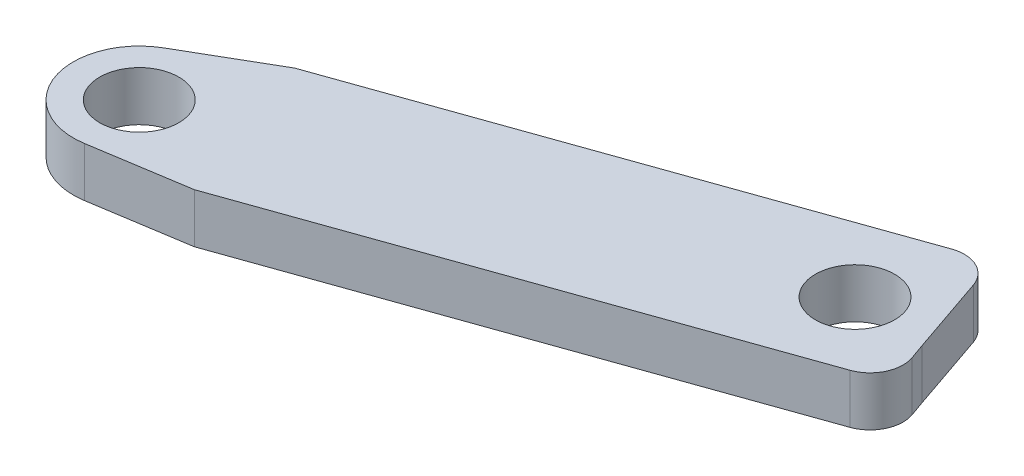
ISO-10303-21;
HEADER;
FILE_DESCRIPTION(('STEP AP214'),'2;1');
FILE_NAME('part.step','',(''),(''),'','','');
FILE_SCHEMA(('AUTOMOTIVE_DESIGN { 1 0 10303 214 1 1 1 1 }'));
ENDSEC;
DATA;
#1=APPLICATION_CONTEXT('core data for automotive mechanical design processes');
#2=APPLICATION_PROTOCOL_DEFINITION('international standard','automotive_design',2000,#1);
#3=PRODUCT_CONTEXT('',#1,'mechanical');
#4=PRODUCT('Part','Part','',(#3));
#5=PRODUCT_RELATED_PRODUCT_CATEGORY('part','',(#4));
#6=PRODUCT_DEFINITION_FORMATION('','',#4);
#7=PRODUCT_DEFINITION_CONTEXT('part definition',#1,'design');
#8=PRODUCT_DEFINITION('design','',#6,#7);
#9=PRODUCT_DEFINITION_SHAPE('','',#8);
#10=(LENGTH_UNIT() NAMED_UNIT(*) SI_UNIT(.MILLI.,.METRE.));
#11=(NAMED_UNIT(*) PLANE_ANGLE_UNIT() SI_UNIT($,.RADIAN.));
#12=(NAMED_UNIT(*) SI_UNIT($,.STERADIAN.) SOLID_ANGLE_UNIT());
#13=UNCERTAINTY_MEASURE_WITH_UNIT(LENGTH_MEASURE(1.E-05),#10,'distance_accuracy_value','');
#14=(GEOMETRIC_REPRESENTATION_CONTEXT(3) GLOBAL_UNCERTAINTY_ASSIGNED_CONTEXT((#13)) GLOBAL_UNIT_ASSIGNED_CONTEXT((#10,
#11,#12)) REPRESENTATION_CONTEXT('',''));
#15=CARTESIAN_POINT('',(0.,0.,0.));
#16=DIRECTION('',(0.,0.,1.));
#17=DIRECTION('',(1.,0.,0.));
#18=AXIS2_PLACEMENT_3D('',#15,#16,#17);
#19=CARTESIAN_POINT('',(12.5415540162845,1.5,11.5198173316022));
#20=DIRECTION('',(0.,1.,0.));
#21=DIRECTION('',(0.,0.,1.));
#22=AXIS2_PLACEMENT_3D('',#19,#20,#21);
#23=PLANE('',#22);
#24=CARTESIAN_POINT('',(-4.01703028974158,1.5,18.9733521381694));
#25=DIRECTION('',(0.,1.,0.));
#26=DIRECTION('',(0.,0.,1.));
#27=AXIS2_PLACEMENT_3D('',#24,#25,#26);
#28=CIRCLE('',#27,1.20000000000027);
#29=CARTESIAN_POINT('',(-4.01703028974158,1.5,20.1733521381697));
#30=VERTEX_POINT('',#29);
#31=EDGE_CURVE('E140',#30,#30,#28,.T.);
#32=ORIENTED_EDGE('',*,*,#31,.F.);
#33=EDGE_LOOP('',(#32));
#34=FACE_BOUND('',#33,.T.);
#35=DIRECTION('',(-0.942666534966548,0.,0.333736129081288));
#36=VECTOR('',#35,1.);
#37=CARTESIAN_POINT('',(9.05204500921084,1.5,11.6944021103235));
#38=LINE('',#37,#36);
#39=CARTESIAN_POINT('',(12.2078178872032,1.5,10.5771507966357));
#40=VERTEX_POINT('',#39);
#41=CARTESIAN_POINT('',(-2.49470427502801,1.5,15.7823454780497));
#42=VERTEX_POINT('',#41);
#43=EDGE_CURVE('E97',#40,#42,#38,.T.);
#44=ORIENTED_EDGE('',*,*,#43,.T.);
#45=DIRECTION('',(-0.865625456021708,0.,0.5006920908974));
#46=VECTOR('',#45,1.);
#47=CARTESIAN_POINT('',(-2.49470427502801,1.5,15.7823454780497));
#48=LINE('',#47,#46);
#49=CARTESIAN_POINT('',(-5.01841447153637,1.5,17.242101226126));
#50=VERTEX_POINT('',#49);
#51=EDGE_CURVE('E234',#42,#50,#48,.T.);
#52=ORIENTED_EDGE('',*,*,#51,.T.);
#53=CARTESIAN_POINT('',(-4.01703028974158,1.5,18.9733521381694));
#54=DIRECTION('',(0.,1.,0.));
#55=DIRECTION('',(0.,0.,1.));
#56=AXIS2_PLACEMENT_3D('',#53,#54,#55);
#57=CIRCLE('',#56,2.);
#58=CARTESIAN_POINT('',(-3.70603693930846,1.5,20.9490249693807));
#59=VERTEX_POINT('',#58);
#60=EDGE_CURVE('E236',#50,#59,#57,.T.);
#61=ORIENTED_EDGE('',*,*,#60,.T.);
#62=DIRECTION('',(0.987836415605638,0.,-0.155496675216562));
#63=VECTOR('',#62,1.);
#64=CARTESIAN_POINT('',(-3.70603693930846,1.5,20.9490249693807));
#65=LINE('',#64,#63);
#66=CARTESIAN_POINT('',(-0.826023629621666,1.5,20.4956781528826));
#67=VERTEX_POINT('',#66);
#68=EDGE_CURVE('E238',#59,#67,#65,.T.);
#69=ORIENTED_EDGE('',*,*,#68,.T.);
#70=DIRECTION('',(0.942666534966548,0.,-0.333736129081287));
#71=VECTOR('',#70,1.);
#72=CARTESIAN_POINT('',(10.7207256546172,1.5,16.4077347851563));
#73=LINE('',#72,#71);
#74=CARTESIAN_POINT('',(13.8538364026168,1.5,15.2985066390044));
#75=VERTEX_POINT('',#74);
#76=EDGE_CURVE('E243',#67,#75,#73,.T.);
#77=ORIENTED_EDGE('',*,*,#76,.T.);
#78=CARTESIAN_POINT('',(13.5201002735355,1.5,14.3558401040379));
#79=DIRECTION('',(0.,1.,0.));
#80=DIRECTION('',(0.,0.,1.));
#81=AXIS2_PLACEMENT_3D('',#78,#79,#80);
#82=CIRCLE('',#81,1.);
#83=CARTESIAN_POINT('',(14.462766808502,1.5,14.0221039749566));
#84=VERTEX_POINT('',#83);
#85=EDGE_CURVE('E120',#75,#84,#82,.T.);
#86=ORIENTED_EDGE('',*,*,#85,.T.);
#87=DIRECTION('',(-0.333736129081291,0.,-0.942666534966547));
#88=VECTOR('',#87,1.);
#89=CARTESIAN_POINT('',(14.4627668085021,1.5,14.0221039749566));
#90=LINE('',#89,#88);
#91=CARTESIAN_POINT('',(14.3006668668351,1.5,13.564238682547));
#92=VERTEX_POINT('',#91);
#93=EDGE_CURVE('E114',#84,#92,#90,.T.);
#94=ORIENTED_EDGE('',*,*,#93,.T.);
#95=DIRECTION('',(-0.32469068500717,0.,-0.945820257273851));
#96=VECTOR('',#95,1.);
#97=CARTESIAN_POINT('',(13.4873742735583,1.5,11.1951266465951));
#98=LINE('',#97,#96);
#99=CARTESIAN_POINT('',(13.4873742735583,1.5,11.1951266465951));
#100=VERTEX_POINT('',#99);
#101=EDGE_CURVE('E118',#92,#100,#98,.T.);
#102=ORIENTED_EDGE('',*,*,#101,.T.);
#103=CARTESIAN_POINT('',(12.5415540162845,1.5,11.5198173316022));
#104=DIRECTION('',(0.,1.,0.));
#105=DIRECTION('',(0.,0.,1.));
#106=AXIS2_PLACEMENT_3D('',#103,#104,#105);
#107=CIRCLE('',#106,0.999999999999998);
#108=EDGE_CURVE('E52',#100,#40,#107,.T.);
#109=ORIENTED_EDGE('',*,*,#108,.T.);
#110=EDGE_LOOP('',(#44,#52,#61,#69,#77,#86,#94,#102,#109));
#111=FACE_BOUND('',#110,.T.);
#112=CARTESIAN_POINT('',(12.0073850355886,1.5,13.3001621573067));
#113=DIRECTION('',(0.,1.,0.));
#114=DIRECTION('',(0.,0.,1.));
#115=AXIS2_PLACEMENT_3D('',#112,#113,#114);
#116=CIRCLE('',#115,1.20000000000001);
#117=CARTESIAN_POINT('',(12.0073850355886,1.5,14.5001621573067));
#118=VERTEX_POINT('',#117);
#119=EDGE_CURVE('E171',#118,#118,#116,.T.);
#120=ORIENTED_EDGE('',*,*,#119,.F.);
#121=EDGE_LOOP('',(#120));
#122=FACE_BOUND('',#121,.T.);
#123=ADVANCED_FACE('F33',(#34,#111,#122),#23,.T.);
#124=CARTESIAN_POINT('',(12.5415540162845,0.,11.5198173316022));
#125=DIRECTION('',(0.,1.,0.));
#126=DIRECTION('',(0.,0.,1.));
#127=AXIS2_PLACEMENT_3D('',#124,#125,#126);
#128=PLANE('',#127);
#129=DIRECTION('',(-0.942666534966548,0.,0.333736129081287));
#130=VECTOR('',#129,1.);
#131=CARTESIAN_POINT('',(9.05204500921084,0.,11.6944021103235));
#132=LINE('',#131,#130);
#133=CARTESIAN_POINT('',(12.2078178872032,0.,10.5771507966357));
#134=VERTEX_POINT('',#133);
#135=CARTESIAN_POINT('',(-2.49470427502801,0.,15.7823454780497));
#136=VERTEX_POINT('',#135);
#137=EDGE_CURVE('E91',#134,#136,#132,.T.);
#138=ORIENTED_EDGE('',*,*,#137,.F.);
#139=CARTESIAN_POINT('',(12.5415540162845,0.,11.5198173316022));
#140=DIRECTION('',(0.,1.,0.));
#141=DIRECTION('',(0.,0.,1.));
#142=AXIS2_PLACEMENT_3D('',#139,#140,#141);
#143=CIRCLE('',#142,0.999999999999998);
#144=CARTESIAN_POINT('',(13.4873742735583,0.,11.1951266465951));
#145=VERTEX_POINT('',#144);
#146=EDGE_CURVE('E154',#145,#134,#143,.T.);
#147=ORIENTED_EDGE('',*,*,#146,.F.);
#148=DIRECTION('',(-0.32469068500717,0.,-0.945820257273851));
#149=VECTOR('',#148,1.);
#150=CARTESIAN_POINT('',(13.4873742735583,0.,11.1951266465951));
#151=LINE('',#150,#149);
#152=CARTESIAN_POINT('',(14.3006668668351,0.,13.564238682547));
#153=VERTEX_POINT('',#152);
#154=EDGE_CURVE('E84',#153,#145,#151,.T.);
#155=ORIENTED_EDGE('',*,*,#154,.F.);
#156=DIRECTION('',(-0.333736129081291,0.,-0.942666534966547));
#157=VECTOR('',#156,1.);
#158=CARTESIAN_POINT('',(14.4627668085021,0.,14.0221039749566));
#159=LINE('',#158,#157);
#160=CARTESIAN_POINT('',(14.462766808502,0.,14.0221039749566));
#161=VERTEX_POINT('',#160);
#162=EDGE_CURVE('E128',#161,#153,#159,.T.);
#163=ORIENTED_EDGE('',*,*,#162,.F.);
#164=CARTESIAN_POINT('',(13.5201002735355,0.,14.3558401040379));
#165=DIRECTION('',(0.,1.,0.));
#166=DIRECTION('',(0.,0.,1.));
#167=AXIS2_PLACEMENT_3D('',#164,#165,#166);
#168=CIRCLE('',#167,1.);
#169=CARTESIAN_POINT('',(13.8538364026168,0.,15.2985066390044));
#170=VERTEX_POINT('',#169);
#171=EDGE_CURVE('E150',#170,#161,#168,.T.);
#172=ORIENTED_EDGE('',*,*,#171,.F.);
#173=DIRECTION('',(0.942666534966548,0.,-0.333736129081287));
#174=VECTOR('',#173,1.);
#175=CARTESIAN_POINT('',(10.7207256546172,0.,16.4077347851563));
#176=LINE('',#175,#174);
#177=CARTESIAN_POINT('',(-0.826023629621666,0.,20.4956781528826));
#178=VERTEX_POINT('',#177);
#179=EDGE_CURVE('E148',#178,#170,#176,.T.);
#180=ORIENTED_EDGE('',*,*,#179,.F.);
#181=DIRECTION('',(0.987836415605636,0.,-0.155496675216575));
#182=VECTOR('',#181,1.);
#183=CARTESIAN_POINT('',(-0.826023629621666,0.,20.4956781528826));
#184=LINE('',#183,#182);
#185=CARTESIAN_POINT('',(-3.70603693930846,0.,20.9490249693807));
#186=VERTEX_POINT('',#185);
#187=EDGE_CURVE('E145',#186,#178,#184,.T.);
#188=ORIENTED_EDGE('',*,*,#187,.F.);
#189=CARTESIAN_POINT('',(-4.01703028974158,0.,18.9733521381694));
#190=DIRECTION('',(0.,1.,0.));
#191=DIRECTION('',(0.,0.,1.));
#192=AXIS2_PLACEMENT_3D('',#189,#190,#191);
#193=CIRCLE('',#192,2.);
#194=CARTESIAN_POINT('',(-5.01841447153637,0.,17.242101226126));
#195=VERTEX_POINT('',#194);
#196=EDGE_CURVE('E142',#195,#186,#193,.T.);
#197=ORIENTED_EDGE('',*,*,#196,.F.);
#198=DIRECTION('',(-0.86562545602171,0.,0.500692090897396));
#199=VECTOR('',#198,1.);
#200=CARTESIAN_POINT('',(-2.71483185404596,0.,15.9096709131279));
#201=LINE('',#200,#199);
#202=EDGE_CURVE('E139',#136,#195,#201,.T.);
#203=ORIENTED_EDGE('',*,*,#202,.F.);
#204=EDGE_LOOP('',(#138,#147,#155,#163,#172,#180,#188,#197,#203));
#205=FACE_BOUND('',#204,.T.);
#206=CARTESIAN_POINT('',(-4.01703028974158,0.,18.9733521381694));
#207=DIRECTION('',(0.,1.,0.));
#208=DIRECTION('',(0.,0.,1.));
#209=AXIS2_PLACEMENT_3D('',#206,#207,#208);
#210=CIRCLE('',#209,1.20000000000027);
#211=CARTESIAN_POINT('',(-4.01703028974158,0.,20.1733521381697));
#212=VERTEX_POINT('',#211);
#213=EDGE_CURVE('E37',#212,#212,#210,.T.);
#214=ORIENTED_EDGE('',*,*,#213,.T.);
#215=EDGE_LOOP('',(#214));
#216=FACE_BOUND('',#215,.T.);
#217=CARTESIAN_POINT('',(12.0073850355886,0.,13.3001621573067));
#218=DIRECTION('',(0.,1.,0.));
#219=DIRECTION('',(0.,0.,1.));
#220=AXIS2_PLACEMENT_3D('',#217,#218,#219);
#221=CIRCLE('',#220,1.20000000000001);
#222=CARTESIAN_POINT('',(12.0073850355886,0.,14.5001621573067));
#223=VERTEX_POINT('',#222);
#224=EDGE_CURVE('E174',#223,#223,#221,.T.);
#225=ORIENTED_EDGE('',*,*,#224,.T.);
#226=EDGE_LOOP('',(#225));
#227=FACE_BOUND('',#226,.T.);
#228=ADVANCED_FACE('F182',(#205,#216,#227),#128,.F.);
#229=CARTESIAN_POINT('',(9.05204500921084,1.5,11.6944021103235));
#230=DIRECTION('',(0.333736129081287,0.,0.942666534966548));
#231=DIRECTION('',(0.942666534966548,0.,-0.333736129081287));
#232=AXIS2_PLACEMENT_3D('',#229,#230,#231);
#233=PLANE('',#232);
#234=ORIENTED_EDGE('',*,*,#137,.T.);
#235=DIRECTION('',(0.,-1.,0.));
#236=VECTOR('',#235,1.);
#237=CARTESIAN_POINT('',(-2.49470427502801,1.5,15.7823454780497));
#238=LINE('',#237,#236);
#239=EDGE_CURVE('E12',#42,#136,#238,.T.);
#240=ORIENTED_EDGE('',*,*,#239,.F.);
#241=ORIENTED_EDGE('',*,*,#43,.F.);
#242=DIRECTION('',(0.,-1.,0.));
#243=VECTOR('',#242,1.);
#244=CARTESIAN_POINT('',(12.2078178872032,1.5,10.5771507966357));
#245=LINE('',#244,#243);
#246=EDGE_CURVE('E134',#40,#134,#245,.T.);
#247=ORIENTED_EDGE('',*,*,#246,.T.);
#248=EDGE_LOOP('',(#234,#240,#241,#247));
#249=FACE_BOUND('',#248,.T.);
#250=ADVANCED_FACE('F201',(#249),#233,.F.);
#251=CARTESIAN_POINT('',(-2.71483185404596,1.5,15.9096709131279));
#252=DIRECTION('',(0.500692090897396,0.,0.86562545602171));
#253=DIRECTION('',(0.86562545602171,0.,-0.500692090897396));
#254=AXIS2_PLACEMENT_3D('',#251,#252,#253);
#255=PLANE('',#254);
#256=ORIENTED_EDGE('',*,*,#202,.T.);
#257=DIRECTION('',(0.,-1.,0.));
#258=VECTOR('',#257,1.);
#259=CARTESIAN_POINT('',(-5.01841447153637,1.5,17.242101226126));
#260=LINE('',#259,#258);
#261=EDGE_CURVE('E43',#50,#195,#260,.T.);
#262=ORIENTED_EDGE('',*,*,#261,.F.);
#263=ORIENTED_EDGE('',*,*,#51,.F.);
#264=ORIENTED_EDGE('',*,*,#239,.T.);
#265=EDGE_LOOP('',(#256,#262,#263,#264));
#266=FACE_BOUND('',#265,.T.);
#267=ADVANCED_FACE('F223',(#266),#255,.F.);
#268=CARTESIAN_POINT('',(-4.01703028974158,1.5,18.9733521381694));
#269=DIRECTION('',(0.,-1.,0.));
#270=DIRECTION('',(0.,0.,-1.));
#271=AXIS2_PLACEMENT_3D('',#268,#269,#270);
#272=CYLINDRICAL_SURFACE('',#271,2.);
#273=ORIENTED_EDGE('',*,*,#196,.T.);
#274=DIRECTION('',(0.,-1.,0.));
#275=VECTOR('',#274,1.);
#276=CARTESIAN_POINT('',(-3.70603693930846,1.5,20.9490249693807));
#277=LINE('',#276,#275);
#278=EDGE_CURVE('E166',#59,#186,#277,.T.);
#279=ORIENTED_EDGE('',*,*,#278,.F.);
#280=ORIENTED_EDGE('',*,*,#60,.F.);
#281=ORIENTED_EDGE('',*,*,#261,.T.);
#282=EDGE_LOOP('',(#273,#279,#280,#281));
#283=FACE_BOUND('',#282,.T.);
#284=ADVANCED_FACE('F219',(#283),#272,.T.);
#285=CARTESIAN_POINT('',(-0.826023629621666,1.5,20.4956781528826));
#286=DIRECTION('',(-0.155496675216575,0.,-0.987836415605636));
#287=DIRECTION('',(-0.987836415605636,0.,0.155496675216575));
#288=AXIS2_PLACEMENT_3D('',#285,#286,#287);
#289=PLANE('',#288);
#290=ORIENTED_EDGE('',*,*,#187,.T.);
#291=DIRECTION('',(0.,-1.,0.));
#292=VECTOR('',#291,1.);
#293=CARTESIAN_POINT('',(-0.826023629621666,1.5,20.4956781528826));
#294=LINE('',#293,#292);
#295=EDGE_CURVE('E163',#67,#178,#294,.T.);
#296=ORIENTED_EDGE('',*,*,#295,.F.);
#297=ORIENTED_EDGE('',*,*,#68,.F.);
#298=ORIENTED_EDGE('',*,*,#278,.T.);
#299=EDGE_LOOP('',(#290,#296,#297,#298));
#300=FACE_BOUND('',#299,.T.);
#301=ADVANCED_FACE('F215',(#300),#289,.F.);
#302=CARTESIAN_POINT('',(10.7207256546172,1.5,16.4077347851563));
#303=DIRECTION('',(-0.333736129081287,0.,-0.942666534966548));
#304=DIRECTION('',(-0.942666534966548,0.,0.333736129081287));
#305=AXIS2_PLACEMENT_3D('',#302,#303,#304);
#306=PLANE('',#305);
#307=ORIENTED_EDGE('',*,*,#179,.T.);
#308=DIRECTION('',(0.,-1.,0.));
#309=VECTOR('',#308,1.);
#310=CARTESIAN_POINT('',(13.8538364026168,1.5,15.2985066390044));
#311=LINE('',#310,#309);
#312=EDGE_CURVE('E160',#75,#170,#311,.T.);
#313=ORIENTED_EDGE('',*,*,#312,.F.);
#314=ORIENTED_EDGE('',*,*,#76,.F.);
#315=ORIENTED_EDGE('',*,*,#295,.T.);
#316=EDGE_LOOP('',(#307,#313,#314,#315));
#317=FACE_BOUND('',#316,.T.);
#318=ADVANCED_FACE('F211',(#317),#306,.F.);
#319=CARTESIAN_POINT('',(13.5201002735355,1.5,14.3558401040379));
#320=DIRECTION('',(0.,-1.,0.));
#321=DIRECTION('',(0.,0.,-1.));
#322=AXIS2_PLACEMENT_3D('',#319,#320,#321);
#323=CYLINDRICAL_SURFACE('',#322,1.);
#324=ORIENTED_EDGE('',*,*,#171,.T.);
#325=DIRECTION('',(0.,-1.,0.));
#326=VECTOR('',#325,1.);
#327=CARTESIAN_POINT('',(14.462766808502,1.5,14.0221039749566));
#328=LINE('',#327,#326);
#329=EDGE_CURVE('E129',#84,#161,#328,.T.);
#330=ORIENTED_EDGE('',*,*,#329,.F.);
#331=ORIENTED_EDGE('',*,*,#85,.F.);
#332=ORIENTED_EDGE('',*,*,#312,.T.);
#333=EDGE_LOOP('',(#324,#330,#331,#332));
#334=FACE_BOUND('',#333,.T.);
#335=ADVANCED_FACE('F208',(#334),#323,.T.);
#336=CARTESIAN_POINT('',(14.4627668085021,1.5,14.0221039749566));
#337=DIRECTION('',(-0.942666534966547,0.,0.333736129081291));
#338=DIRECTION('',(0.333736129081291,0.,0.942666534966547));
#339=AXIS2_PLACEMENT_3D('',#336,#337,#338);
#340=PLANE('',#339);
#341=ORIENTED_EDGE('',*,*,#162,.T.);
#342=DIRECTION('',(0.,-1.,0.));
#343=VECTOR('',#342,1.);
#344=CARTESIAN_POINT('',(14.3006668668351,1.5,13.564238682547));
#345=LINE('',#344,#343);
#346=EDGE_CURVE('E125',#92,#153,#345,.T.);
#347=ORIENTED_EDGE('',*,*,#346,.F.);
#348=ORIENTED_EDGE('',*,*,#93,.F.);
#349=ORIENTED_EDGE('',*,*,#329,.T.);
#350=EDGE_LOOP('',(#341,#347,#348,#349));
#351=FACE_BOUND('',#350,.T.);
#352=ADVANCED_FACE('F126',(#351),#340,.F.);
#353=CARTESIAN_POINT('',(13.4873742735583,1.5,11.1951266465951));
#354=DIRECTION('',(-0.945820257273851,0.,0.32469068500717));
#355=DIRECTION('',(0.32469068500717,0.,0.945820257273852));
#356=AXIS2_PLACEMENT_3D('',#353,#354,#355);
#357=PLANE('',#356);
#358=ORIENTED_EDGE('',*,*,#154,.T.);
#359=DIRECTION('',(0.,-1.,0.));
#360=VECTOR('',#359,1.);
#361=CARTESIAN_POINT('',(13.4873742735583,1.5,11.1951266465951));
#362=LINE('',#361,#360);
#363=EDGE_CURVE('E130',#100,#145,#362,.T.);
#364=ORIENTED_EDGE('',*,*,#363,.F.);
#365=ORIENTED_EDGE('',*,*,#101,.F.);
#366=ORIENTED_EDGE('',*,*,#346,.T.);
#367=EDGE_LOOP('',(#358,#364,#365,#366));
#368=FACE_BOUND('',#367,.T.);
#369=ADVANCED_FACE('F132',(#368),#357,.F.);
#370=CARTESIAN_POINT('',(12.5415540162845,1.5,11.5198173316022));
#371=DIRECTION('',(0.,-1.,0.));
#372=DIRECTION('',(0.,0.,-1.));
#373=AXIS2_PLACEMENT_3D('',#370,#371,#372);
#374=CYLINDRICAL_SURFACE('',#373,0.999999999999998);
#375=ORIENTED_EDGE('',*,*,#146,.T.);
#376=ORIENTED_EDGE('',*,*,#246,.F.);
#377=ORIENTED_EDGE('',*,*,#108,.F.);
#378=ORIENTED_EDGE('',*,*,#363,.T.);
#379=EDGE_LOOP('',(#375,#376,#377,#378));
#380=FACE_BOUND('',#379,.T.);
#381=ADVANCED_FACE('F187',(#380),#374,.T.);
#382=CARTESIAN_POINT('',(-4.01703028974158,1.5,18.9733521381694));
#383=DIRECTION('',(0.,-1.,0.));
#384=DIRECTION('',(0.,0.,-1.));
#385=AXIS2_PLACEMENT_3D('',#382,#383,#384);
#386=CYLINDRICAL_SURFACE('',#385,1.20000000000027);
#387=ORIENTED_EDGE('',*,*,#31,.T.);
#388=EDGE_LOOP('',(#387));
#389=FACE_BOUND('',#388,.T.);
#390=ORIENTED_EDGE('',*,*,#213,.F.);
#391=EDGE_LOOP('',(#390));
#392=FACE_BOUND('',#391,.T.);
#393=ADVANCED_FACE('F35',(#389,#392),#386,.F.);
#394=CARTESIAN_POINT('',(12.0073850355886,1.5,13.3001621573067));
#395=DIRECTION('',(0.,-1.,0.));
#396=DIRECTION('',(0.,0.,-1.));
#397=AXIS2_PLACEMENT_3D('',#394,#395,#396);
#398=CYLINDRICAL_SURFACE('',#397,1.20000000000001);
#399=ORIENTED_EDGE('',*,*,#119,.T.);
#400=EDGE_LOOP('',(#399));
#401=FACE_BOUND('',#400,.T.);
#402=ORIENTED_EDGE('',*,*,#224,.F.);
#403=EDGE_LOOP('',(#402));
#404=FACE_BOUND('',#403,.T.);
#405=ADVANCED_FACE('F186',(#401,#404),#398,.F.);
#406=CLOSED_SHELL('',(#123,#228,#250,#267,#284,#301,#318,#335,#352,#369,#381,#393,#405));
#407=MANIFOLD_SOLID_BREP('B2',#406);
#408=ADVANCED_BREP_SHAPE_REPRESENTATION('',(#18,#407),#14);
#409=SHAPE_DEFINITION_REPRESENTATION(#9,#408);
ENDSEC;
END-ISO-10303-21;
